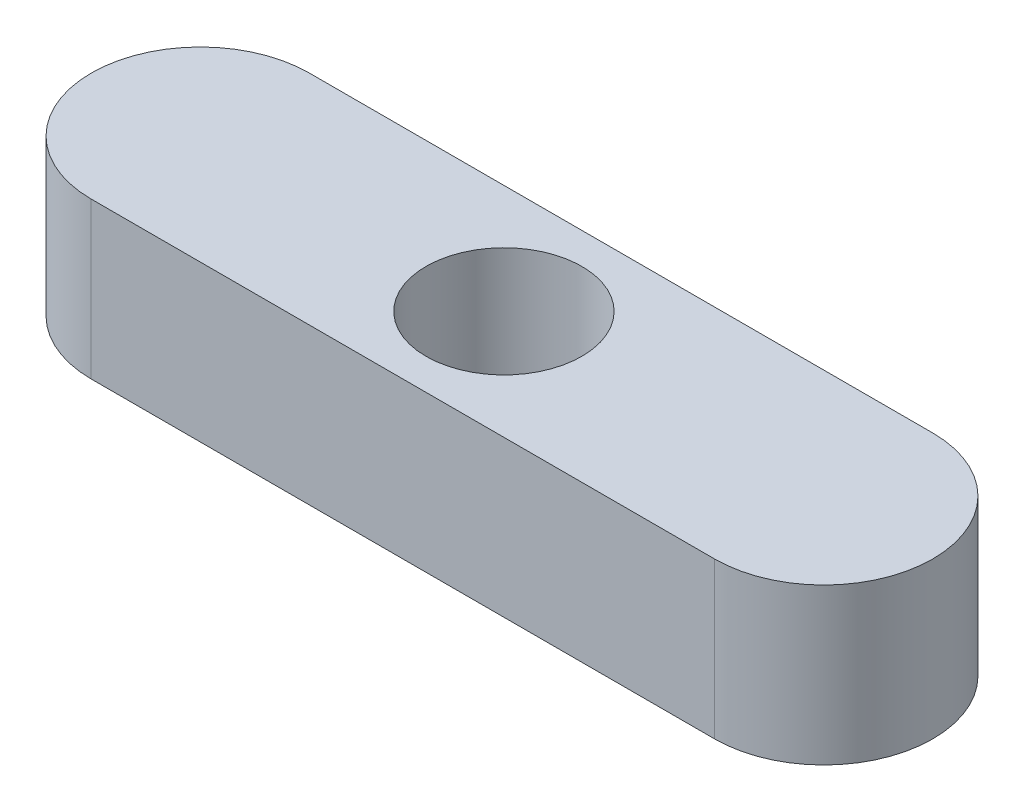
ISO-10303-21;
HEADER;
FILE_DESCRIPTION(('STEP AP214'),'2;1');
FILE_NAME('part.step','',(''),(''),'','','');
FILE_SCHEMA(('AUTOMOTIVE_DESIGN { 1 0 10303 214 1 1 1 1 }'));
ENDSEC;
DATA;
#1=APPLICATION_CONTEXT('core data for automotive mechanical design processes');
#2=APPLICATION_PROTOCOL_DEFINITION('international standard','automotive_design',2000,#1);
#3=PRODUCT_CONTEXT('',#1,'mechanical');
#4=PRODUCT('Part','Part','',(#3));
#5=PRODUCT_RELATED_PRODUCT_CATEGORY('part','',(#4));
#6=PRODUCT_DEFINITION_FORMATION('','',#4);
#7=PRODUCT_DEFINITION_CONTEXT('part definition',#1,'design');
#8=PRODUCT_DEFINITION('design','',#6,#7);
#9=PRODUCT_DEFINITION_SHAPE('','',#8);
#10=(LENGTH_UNIT() NAMED_UNIT(*) SI_UNIT(.MILLI.,.METRE.));
#11=(NAMED_UNIT(*) PLANE_ANGLE_UNIT() SI_UNIT($,.RADIAN.));
#12=(NAMED_UNIT(*) SI_UNIT($,.STERADIAN.) SOLID_ANGLE_UNIT());
#13=UNCERTAINTY_MEASURE_WITH_UNIT(LENGTH_MEASURE(1.E-05),#10,'distance_accuracy_value','');
#14=(GEOMETRIC_REPRESENTATION_CONTEXT(3) GLOBAL_UNCERTAINTY_ASSIGNED_CONTEXT((#13)) GLOBAL_UNIT_ASSIGNED_CONTEXT((#10,
#11,#12)) REPRESENTATION_CONTEXT('',''));
#15=CARTESIAN_POINT('',(0.,0.,0.));
#16=DIRECTION('',(0.,0.,1.));
#17=DIRECTION('',(1.,0.,0.));
#18=AXIS2_PLACEMENT_3D('',#15,#16,#17);
#19=CARTESIAN_POINT('',(-12.3712941176471,6.35,-1.10564705882353));
#20=DIRECTION('',(0.,-1.,0.));
#21=DIRECTION('',(0.,0.,-1.));
#22=AXIS2_PLACEMENT_3D('',#19,#20,#21);
#23=CYLINDRICAL_SURFACE('',#22,4.445);
#24=CARTESIAN_POINT('',(-12.3712941176471,0.,-1.10564705882353));
#25=DIRECTION('',(0.,1.,0.));
#26=DIRECTION('',(0.,0.,1.));
#27=AXIS2_PLACEMENT_3D('',#24,#25,#26);
#28=CIRCLE('',#27,4.445);
#29=CARTESIAN_POINT('',(-12.3712941176471,0.,-5.55064705882353));
#30=VERTEX_POINT('',#29);
#31=CARTESIAN_POINT('',(-12.3712941176471,0.,3.33935294117647));
#32=VERTEX_POINT('',#31);
#33=EDGE_CURVE('E96',#30,#32,#28,.T.);
#34=ORIENTED_EDGE('',*,*,#33,.T.);
#35=DIRECTION('',(0.,-1.,0.));
#36=VECTOR('',#35,1.);
#37=CARTESIAN_POINT('',(-12.3712941176471,6.35,3.33935294117647));
#38=LINE('',#37,#36);
#39=CARTESIAN_POINT('',(-12.3712941176471,6.35,3.33935294117647));
#40=VERTEX_POINT('',#39);
#41=EDGE_CURVE('E11',#40,#32,#38,.T.);
#42=ORIENTED_EDGE('',*,*,#41,.F.);
#43=CARTESIAN_POINT('',(-12.3712941176471,6.35,-1.10564705882353));
#44=DIRECTION('',(0.,1.,0.));
#45=DIRECTION('',(0.,0.,1.));
#46=AXIS2_PLACEMENT_3D('',#43,#44,#45);
#47=CIRCLE('',#46,4.445);
#48=CARTESIAN_POINT('',(-12.3712941176471,6.35,-5.55064705882353));
#49=VERTEX_POINT('',#48);
#50=EDGE_CURVE('E84',#49,#40,#47,.T.);
#51=ORIENTED_EDGE('',*,*,#50,.F.);
#52=DIRECTION('',(0.,-1.,0.));
#53=VECTOR('',#52,1.);
#54=CARTESIAN_POINT('',(-12.3712941176471,6.35,-5.55064705882353));
#55=LINE('',#54,#53);
#56=EDGE_CURVE('E92',#49,#30,#55,.T.);
#57=ORIENTED_EDGE('',*,*,#56,.T.);
#58=EDGE_LOOP('',(#34,#42,#51,#57));
#59=FACE_BOUND('',#58,.T.);
#60=ADVANCED_FACE('F33',(#59),#23,.T.);
#61=CARTESIAN_POINT('',(-12.3712941176471,6.35,3.33935294117647));
#62=DIRECTION('',(0.,0.,-1.));
#63=DIRECTION('',(-1.,0.,0.));
#64=AXIS2_PLACEMENT_3D('',#61,#62,#63);
#65=PLANE('',#64);
#66=DIRECTION('',(1.,0.,0.));
#67=VECTOR('',#66,1.);
#68=CARTESIAN_POINT('',(-12.3712941176471,0.,3.33935294117647));
#69=LINE('',#68,#67);
#70=CARTESIAN_POINT('',(13.0287058823529,0.,3.33935294117647));
#71=VERTEX_POINT('',#70);
#72=EDGE_CURVE('E88',#32,#71,#69,.T.);
#73=ORIENTED_EDGE('',*,*,#72,.T.);
#74=DIRECTION('',(0.,-1.,0.));
#75=VECTOR('',#74,1.);
#76=CARTESIAN_POINT('',(13.0287058823529,6.35,3.33935294117647));
#77=LINE('',#76,#75);
#78=CARTESIAN_POINT('',(13.0287058823529,6.35,3.33935294117647));
#79=VERTEX_POINT('',#78);
#80=EDGE_CURVE('E41',#79,#71,#77,.T.);
#81=ORIENTED_EDGE('',*,*,#80,.F.);
#82=DIRECTION('',(1.,0.,0.));
#83=VECTOR('',#82,1.);
#84=CARTESIAN_POINT('',(-12.3712941176471,6.35,3.33935294117647));
#85=LINE('',#84,#83);
#86=EDGE_CURVE('E79',#40,#79,#85,.T.);
#87=ORIENTED_EDGE('',*,*,#86,.F.);
#88=ORIENTED_EDGE('',*,*,#41,.T.);
#89=EDGE_LOOP('',(#73,#81,#87,#88));
#90=FACE_BOUND('',#89,.T.);
#91=ADVANCED_FACE('F87',(#90),#65,.F.);
#92=CARTESIAN_POINT('',(13.0287058823529,6.35,-1.10564705882354));
#93=DIRECTION('',(0.,-1.,0.));
#94=DIRECTION('',(0.,0.,-1.));
#95=AXIS2_PLACEMENT_3D('',#92,#93,#94);
#96=CYLINDRICAL_SURFACE('',#95,4.44500000000001);
#97=CARTESIAN_POINT('',(13.0287058823529,0.,-1.10564705882354));
#98=DIRECTION('',(0.,1.,0.));
#99=DIRECTION('',(0.,0.,-1.));
#100=AXIS2_PLACEMENT_3D('',#97,#98,#99);
#101=CIRCLE('',#100,4.44500000000001);
#102=CARTESIAN_POINT('',(13.0287058823529,0.,-5.55064705882355));
#103=VERTEX_POINT('',#102);
#104=EDGE_CURVE('E66',#71,#103,#101,.T.);
#105=ORIENTED_EDGE('',*,*,#104,.T.);
#106=DIRECTION('',(0.,-1.,0.));
#107=VECTOR('',#106,1.);
#108=CARTESIAN_POINT('',(13.0287058823529,6.35,-5.55064705882355));
#109=LINE('',#108,#107);
#110=CARTESIAN_POINT('',(13.0287058823529,6.35,-5.55064705882355));
#111=VERTEX_POINT('',#110);
#112=EDGE_CURVE('E89',#111,#103,#109,.T.);
#113=ORIENTED_EDGE('',*,*,#112,.F.);
#114=CARTESIAN_POINT('',(13.0287058823529,6.35,-1.10564705882354));
#115=DIRECTION('',(0.,1.,0.));
#116=DIRECTION('',(0.,0.,-1.));
#117=AXIS2_PLACEMENT_3D('',#114,#115,#116);
#118=CIRCLE('',#117,4.44500000000001);
#119=EDGE_CURVE('E82',#79,#111,#118,.T.);
#120=ORIENTED_EDGE('',*,*,#119,.F.);
#121=ORIENTED_EDGE('',*,*,#80,.T.);
#122=EDGE_LOOP('',(#105,#113,#120,#121));
#123=FACE_BOUND('',#122,.T.);
#124=ADVANCED_FACE('F90',(#123),#96,.T.);
#125=CARTESIAN_POINT('',(-12.3712941176471,6.35,-5.55064705882353));
#126=DIRECTION('',(0.,0.,1.));
#127=DIRECTION('',(1.,0.,0.));
#128=AXIS2_PLACEMENT_3D('',#125,#126,#127);
#129=PLANE('',#128);
#130=DIRECTION('',(-1.,0.,0.));
#131=VECTOR('',#130,1.);
#132=CARTESIAN_POINT('',(-12.3712941176471,0.,-5.55064705882353));
#133=LINE('',#132,#131);
#134=EDGE_CURVE('E72',#103,#30,#133,.T.);
#135=ORIENTED_EDGE('',*,*,#134,.T.);
#136=ORIENTED_EDGE('',*,*,#56,.F.);
#137=DIRECTION('',(-1.,0.,0.));
#138=VECTOR('',#137,1.);
#139=CARTESIAN_POINT('',(-12.3712941176471,6.35,-5.55064705882353));
#140=LINE('',#139,#138);
#141=EDGE_CURVE('E49',#111,#49,#140,.T.);
#142=ORIENTED_EDGE('',*,*,#141,.F.);
#143=ORIENTED_EDGE('',*,*,#112,.T.);
#144=EDGE_LOOP('',(#135,#136,#142,#143));
#145=FACE_BOUND('',#144,.T.);
#146=ADVANCED_FACE('F104',(#145),#129,.F.);
#147=CARTESIAN_POINT('',(-12.3712941176471,6.35,-1.10564705882353));
#148=DIRECTION('',(0.,1.,0.));
#149=DIRECTION('',(0.,0.,1.));
#150=AXIS2_PLACEMENT_3D('',#147,#148,#149);
#151=PLANE('',#150);
#152=CARTESIAN_POINT('',(0.,6.35,-1.10564705882354));
#153=DIRECTION('',(0.,1.,0.));
#154=DIRECTION('',(0.,0.,1.));
#155=AXIS2_PLACEMENT_3D('',#152,#153,#154);
#156=CIRCLE('',#155,3.175);
#157=CARTESIAN_POINT('',(0.,6.35,2.06935294117646));
#158=VERTEX_POINT('',#157);
#159=EDGE_CURVE('E110',#158,#158,#156,.T.);
#160=ORIENTED_EDGE('',*,*,#159,.F.);
#161=EDGE_LOOP('',(#160));
#162=FACE_BOUND('',#161,.T.);
#163=ORIENTED_EDGE('',*,*,#50,.T.);
#164=ORIENTED_EDGE('',*,*,#86,.T.);
#165=ORIENTED_EDGE('',*,*,#119,.T.);
#166=ORIENTED_EDGE('',*,*,#141,.T.);
#167=EDGE_LOOP('',(#163,#164,#165,#166));
#168=FACE_BOUND('',#167,.T.);
#169=ADVANCED_FACE('F80',(#162,#168),#151,.T.);
#170=CARTESIAN_POINT('',(-12.3712941176471,0.,-1.10564705882353));
#171=DIRECTION('',(0.,1.,0.));
#172=DIRECTION('',(0.,0.,1.));
#173=AXIS2_PLACEMENT_3D('',#170,#171,#172);
#174=PLANE('',#173);
#175=CARTESIAN_POINT('',(0.,0.,-1.10564705882354));
#176=DIRECTION('',(0.,1.,0.));
#177=DIRECTION('',(0.,0.,1.));
#178=AXIS2_PLACEMENT_3D('',#175,#176,#177);
#179=CIRCLE('',#178,3.175);
#180=CARTESIAN_POINT('',(0.,0.,2.06935294117646));
#181=VERTEX_POINT('',#180);
#182=EDGE_CURVE('E99',#181,#181,#179,.T.);
#183=ORIENTED_EDGE('',*,*,#182,.T.);
#184=EDGE_LOOP('',(#183));
#185=FACE_BOUND('',#184,.T.);
#186=ORIENTED_EDGE('',*,*,#33,.F.);
#187=ORIENTED_EDGE('',*,*,#134,.F.);
#188=ORIENTED_EDGE('',*,*,#104,.F.);
#189=ORIENTED_EDGE('',*,*,#72,.F.);
#190=EDGE_LOOP('',(#186,#187,#188,#189));
#191=FACE_BOUND('',#190,.T.);
#192=ADVANCED_FACE('F107',(#185,#191),#174,.F.);
#193=CARTESIAN_POINT('',(0.,0.,-1.10564705882354));
#194=DIRECTION('',(0.,1.,0.));
#195=DIRECTION('',(0.,0.,1.));
#196=AXIS2_PLACEMENT_3D('',#193,#194,#195);
#197=CYLINDRICAL_SURFACE('',#196,3.175);
#198=ORIENTED_EDGE('',*,*,#182,.F.);
#199=EDGE_LOOP('',(#198));
#200=FACE_BOUND('',#199,.T.);
#201=ORIENTED_EDGE('',*,*,#159,.T.);
#202=EDGE_LOOP('',(#201));
#203=FACE_BOUND('',#202,.T.);
#204=ADVANCED_FACE('F117',(#200,#203),#197,.F.);
#205=CLOSED_SHELL('',(#60,#91,#124,#146,#169,#192,#204));
#206=MANIFOLD_SOLID_BREP('B2',#205);
#207=ADVANCED_BREP_SHAPE_REPRESENTATION('',(#18,#206),#14);
#208=SHAPE_DEFINITION_REPRESENTATION(#9,#207);
ENDSEC;
END-ISO-10303-21;
